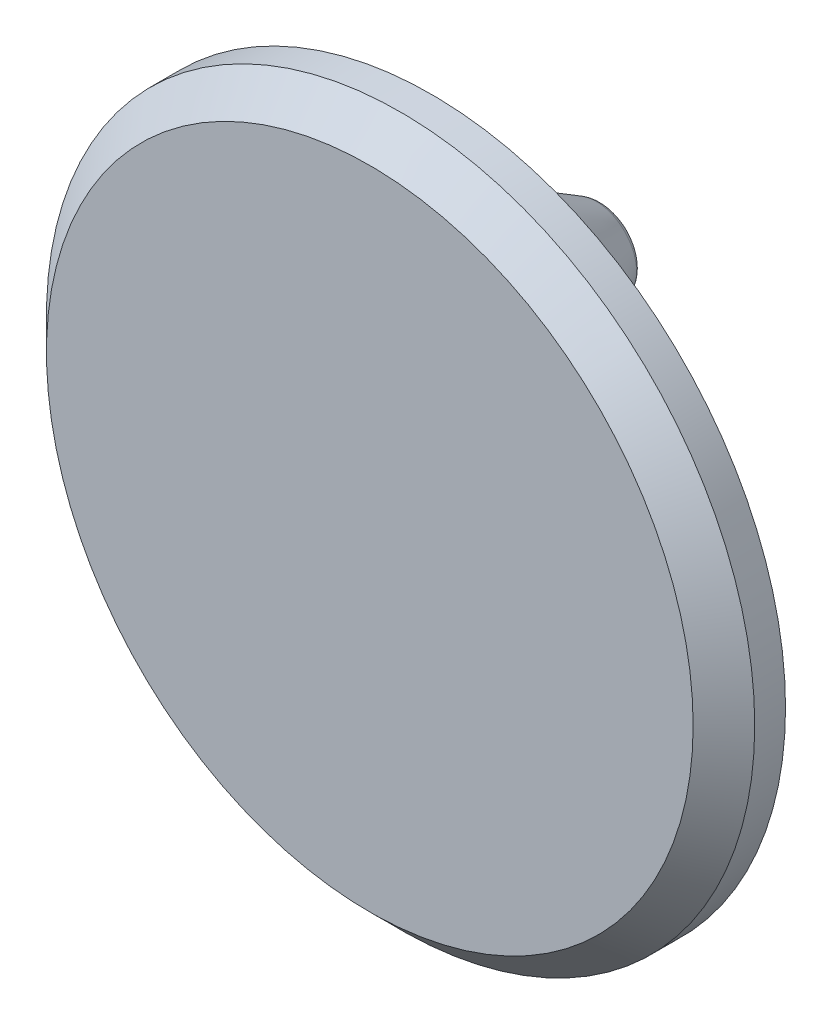
ISO-10303-21;
HEADER;
FILE_DESCRIPTION(('STEP AP214'),'2;1');
FILE_NAME('part.step','',(''),(''),'','','');
FILE_SCHEMA(('AUTOMOTIVE_DESIGN { 1 0 10303 214 1 1 1 1 }'));
ENDSEC;
DATA;
#1=APPLICATION_CONTEXT('core data for automotive mechanical design processes');
#2=APPLICATION_PROTOCOL_DEFINITION('international standard','automotive_design',2000,#1);
#3=PRODUCT_CONTEXT('',#1,'mechanical');
#4=PRODUCT('Part','Part','',(#3));
#5=PRODUCT_RELATED_PRODUCT_CATEGORY('part','',(#4));
#6=PRODUCT_DEFINITION_FORMATION('','',#4);
#7=PRODUCT_DEFINITION_CONTEXT('part definition',#1,'design');
#8=PRODUCT_DEFINITION('design','',#6,#7);
#9=PRODUCT_DEFINITION_SHAPE('','',#8);
#10=(LENGTH_UNIT() NAMED_UNIT(*) SI_UNIT(.MILLI.,.METRE.));
#11=(NAMED_UNIT(*) PLANE_ANGLE_UNIT() SI_UNIT($,.RADIAN.));
#12=(NAMED_UNIT(*) SI_UNIT($,.STERADIAN.) SOLID_ANGLE_UNIT());
#13=UNCERTAINTY_MEASURE_WITH_UNIT(LENGTH_MEASURE(1.E-05),#10,'distance_accuracy_value','');
#14=(GEOMETRIC_REPRESENTATION_CONTEXT(3) GLOBAL_UNCERTAINTY_ASSIGNED_CONTEXT((#13)) GLOBAL_UNIT_ASSIGNED_CONTEXT((#10,
#11,#12)) REPRESENTATION_CONTEXT('',''));
#15=CARTESIAN_POINT('',(0.,0.,0.));
#16=DIRECTION('',(0.,0.,1.));
#17=DIRECTION('',(1.,0.,0.));
#18=AXIS2_PLACEMENT_3D('',#15,#16,#17);
#19=CARTESIAN_POINT('',(0.,0.,2.));
#20=DIRECTION('',(0.,0.,-1.));
#21=DIRECTION('',(-1.,0.,0.));
#22=AXIS2_PLACEMENT_3D('',#19,#20,#21);
#23=CYLINDRICAL_SURFACE('',#22,11.5);
#24=CARTESIAN_POINT('',(0.,0.,0.999999999999992));
#25=DIRECTION('',(0.,0.,1.));
#26=DIRECTION('',(1.,0.,0.));
#27=AXIS2_PLACEMENT_3D('',#24,#25,#26);
#28=CIRCLE('',#27,11.5);
#29=CARTESIAN_POINT('',(11.5,0.,0.999999999999992));
#30=VERTEX_POINT('',#29);
#31=EDGE_CURVE('E41',#30,#30,#28,.F.);
#32=ORIENTED_EDGE('',*,*,#31,.T.);
#33=EDGE_LOOP('',(#32));
#34=FACE_BOUND('',#33,.T.);
#35=CARTESIAN_POINT('',(0.,0.,0.));
#36=DIRECTION('',(0.,0.,1.));
#37=DIRECTION('',(1.,0.,0.));
#38=AXIS2_PLACEMENT_3D('',#35,#36,#37);
#39=CIRCLE('',#38,11.5);
#40=CARTESIAN_POINT('',(11.5,0.,0.));
#41=VERTEX_POINT('',#40);
#42=EDGE_CURVE('E53',#41,#41,#39,.T.);
#43=ORIENTED_EDGE('',*,*,#42,.T.);
#44=EDGE_LOOP('',(#43));
#45=FACE_BOUND('',#44,.T.);
#46=ADVANCED_FACE('F30',(#34,#45),#23,.T.);
#47=CARTESIAN_POINT('',(0.,0.,2.));
#48=DIRECTION('',(0.,0.,1.));
#49=DIRECTION('',(1.,0.,0.));
#50=AXIS2_PLACEMENT_3D('',#47,#48,#49);
#51=PLANE('',#50);
#52=CARTESIAN_POINT('',(0.,0.,2.));
#53=DIRECTION('',(0.,0.,1.));
#54=DIRECTION('',(1.,0.,0.));
#55=AXIS2_PLACEMENT_3D('',#52,#53,#54);
#56=CIRCLE('',#55,10.5);
#57=CARTESIAN_POINT('',(10.5,0.,2.));
#58=VERTEX_POINT('',#57);
#59=EDGE_CURVE('E45',#58,#58,#56,.T.);
#60=ORIENTED_EDGE('',*,*,#59,.T.);
#61=EDGE_LOOP('',(#60));
#62=FACE_BOUND('',#61,.T.);
#63=ADVANCED_FACE('F79',(#62),#51,.T.);
#64=CARTESIAN_POINT('',(0.,0.,0.));
#65=DIRECTION('',(0.,0.,1.));
#66=DIRECTION('',(1.,0.,0.));
#67=AXIS2_PLACEMENT_3D('',#64,#65,#66);
#68=PLANE('',#67);
#69=CARTESIAN_POINT('',(0.,4.5,0.));
#70=DIRECTION('',(0.,0.,1.));
#71=DIRECTION('',(1.,0.,0.));
#72=AXIS2_PLACEMENT_3D('',#69,#70,#71);
#73=CIRCLE('',#72,2.4);
#74=CARTESIAN_POINT('',(2.4,4.5,0.));
#75=VERTEX_POINT('',#74);
#76=EDGE_CURVE('E50',#75,#75,#73,.F.);
#77=ORIENTED_EDGE('',*,*,#76,.F.);
#78=EDGE_LOOP('',(#77));
#79=FACE_BOUND('',#78,.T.);
#80=ORIENTED_EDGE('',*,*,#42,.F.);
#81=EDGE_LOOP('',(#80));
#82=FACE_BOUND('',#81,.T.);
#83=ADVANCED_FACE('F85',(#79,#82),#68,.F.);
#84=CARTESIAN_POINT('',(0.,4.5,0.));
#85=DIRECTION('',(0.,0.,1.));
#86=DIRECTION('',(0.,-1.,0.));
#87=AXIS2_PLACEMENT_3D('',#84,#85,#86);
#88=CYLINDRICAL_SURFACE('',#87,2.4);
#89=ORIENTED_EDGE('',*,*,#76,.T.);
#90=EDGE_LOOP('',(#89));
#91=FACE_BOUND('',#90,.T.);
#92=CARTESIAN_POINT('',(0.,4.5,-2.6));
#93=DIRECTION('',(0.,0.,1.));
#94=DIRECTION('',(0.,-1.,0.));
#95=AXIS2_PLACEMENT_3D('',#92,#93,#94);
#96=CIRCLE('',#95,2.4);
#97=CARTESIAN_POINT('',(0.,2.1,-2.6));
#98=VERTEX_POINT('',#97);
#99=EDGE_CURVE('E56',#98,#98,#96,.T.);
#100=ORIENTED_EDGE('',*,*,#99,.T.);
#101=EDGE_LOOP('',(#100));
#102=FACE_BOUND('',#101,.T.);
#103=ADVANCED_FACE('F75',(#91,#102),#88,.T.);
#104=CARTESIAN_POINT('',(0.,6.9,-2.6));
#105=DIRECTION('',(0.,0.,-1.));
#106=DIRECTION('',(0.,1.,0.));
#107=AXIS2_PLACEMENT_3D('',#104,#105,#106);
#108=PLANE('',#107);
#109=ORIENTED_EDGE('',*,*,#99,.F.);
#110=EDGE_LOOP('',(#109));
#111=FACE_BOUND('',#110,.T.);
#112=CARTESIAN_POINT('',(0.,4.5,-2.6));
#113=DIRECTION('',(0.,0.,1.));
#114=DIRECTION('',(0.,-1.,0.));
#115=AXIS2_PLACEMENT_3D('',#112,#113,#114);
#116=CIRCLE('',#115,2.9);
#117=CARTESIAN_POINT('',(0.,1.6,-2.6));
#118=VERTEX_POINT('',#117);
#119=EDGE_CURVE('E59',#118,#118,#116,.T.);
#120=ORIENTED_EDGE('',*,*,#119,.T.);
#121=EDGE_LOOP('',(#120));
#122=FACE_BOUND('',#121,.T.);
#123=ADVANCED_FACE('F63',(#111,#122),#108,.F.);
#124=CARTESIAN_POINT('',(0.,4.5,-5.6));
#125=DIRECTION('',(0.,0.,1.));
#126=DIRECTION('',(0.,-1.,0.));
#127=AXIS2_PLACEMENT_3D('',#124,#125,#126);
#128=CONICAL_SURFACE('',#127,1.16794919243111,0.523598775598303);
#129=CARTESIAN_POINT('',(0.,4.5,-5.35));
#130=DIRECTION('',(0.,0.,-1.));
#131=DIRECTION('',(0.,1.,0.));
#132=AXIS2_PLACEMENT_3D('',#129,#130,#131);
#133=CIRCLE('',#132,1.31228675972851);
#134=CARTESIAN_POINT('',(0.,5.81228675972851,-5.35));
#135=VERTEX_POINT('',#134);
#136=EDGE_CURVE('E37',#135,#135,#133,.F.);
#137=ORIENTED_EDGE('',*,*,#136,.T.);
#138=EDGE_LOOP('',(#137));
#139=FACE_BOUND('',#138,.T.);
#140=ORIENTED_EDGE('',*,*,#119,.F.);
#141=EDGE_LOOP('',(#140));
#142=FACE_BOUND('',#141,.T.);
#143=ADVANCED_FACE('F65',(#139,#142),#128,.T.);
#144=CARTESIAN_POINT('',(0.,5.6679491924311,-5.6));
#145=DIRECTION('',(0.,0.,1.));
#146=DIRECTION('',(0.,-1.,0.));
#147=AXIS2_PLACEMENT_3D('',#144,#145,#146);
#148=PLANE('',#147);
#149=CARTESIAN_POINT('',(0.,4.5,-5.6));
#150=DIRECTION('',(0.,0.,1.));
#151=DIRECTION('',(0.,-1.,0.));
#152=AXIS2_PLACEMENT_3D('',#149,#150,#151);
#153=CIRCLE('',#152,0.879274057836294);
#154=CARTESIAN_POINT('',(0.,3.62072594216371,-5.6));
#155=VERTEX_POINT('',#154);
#156=EDGE_CURVE('E10',#155,#155,#153,.F.);
#157=ORIENTED_EDGE('',*,*,#156,.T.);
#158=EDGE_LOOP('',(#157));
#159=FACE_BOUND('',#158,.T.);
#160=ADVANCED_FACE('F67',(#159),#148,.F.);
#161=CARTESIAN_POINT('',(0.,0.,2.));
#162=DIRECTION('',(0.,0.,-1.));
#163=DIRECTION('',(-1.,0.,0.));
#164=AXIS2_PLACEMENT_3D('',#161,#162,#163);
#165=CONICAL_SURFACE('',#164,10.5,0.785398163397448);
#166=ORIENTED_EDGE('',*,*,#31,.F.);
#167=EDGE_LOOP('',(#166));
#168=FACE_BOUND('',#167,.T.);
#169=ORIENTED_EDGE('',*,*,#59,.F.);
#170=EDGE_LOOP('',(#169));
#171=FACE_BOUND('',#170,.T.);
#172=ADVANCED_FACE('F73',(#168,#171),#165,.T.);
#173=CARTESIAN_POINT('',(0.,4.5,-5.1));
#174=DIRECTION('',(0.,0.,1.));
#175=DIRECTION('',(0.,-1.,0.));
#176=AXIS2_PLACEMENT_3D('',#173,#174,#175);
#177=TOROIDAL_SURFACE('',#176,0.879274057836294,0.5);
#178=ORIENTED_EDGE('',*,*,#156,.F.);
#179=EDGE_LOOP('',(#178));
#180=FACE_BOUND('',#179,.T.);
#181=ORIENTED_EDGE('',*,*,#136,.F.);
#182=EDGE_LOOP('',(#181));
#183=FACE_BOUND('',#182,.T.);
#184=ADVANCED_FACE('F32',(#180,#183),#177,.T.);
#185=CLOSED_SHELL('',(#46,#63,#83,#103,#123,#143,#160,#172,#184));
#186=MANIFOLD_SOLID_BREP('B2',#185);
#187=ADVANCED_BREP_SHAPE_REPRESENTATION('',(#18,#186),#14);
#188=SHAPE_DEFINITION_REPRESENTATION(#9,#187);
ENDSEC;
END-ISO-10303-21;
